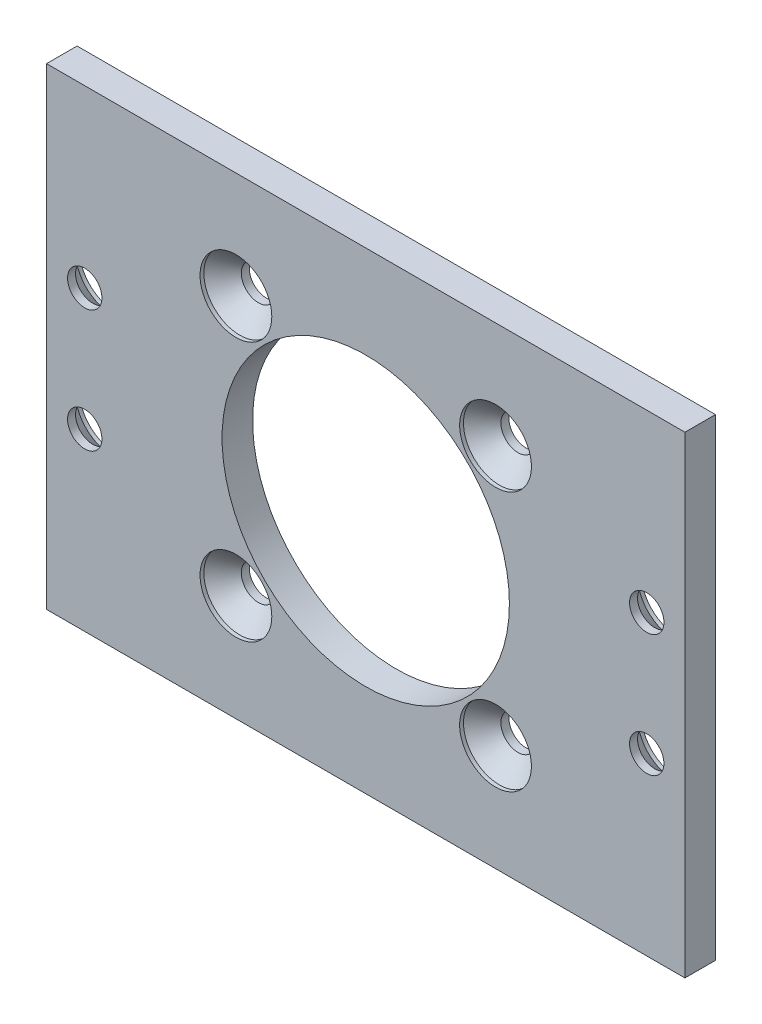
ISO-10303-21;
HEADER;
FILE_DESCRIPTION(('STEP AP214'),'2;1');
FILE_NAME('part.step','',(''),(''),'','','');
FILE_SCHEMA(('AUTOMOTIVE_DESIGN { 1 0 10303 214 1 1 1 1 }'));
ENDSEC;
DATA;
#1=APPLICATION_CONTEXT('core data for automotive mechanical design processes');
#2=APPLICATION_PROTOCOL_DEFINITION('international standard','automotive_design',2000,#1);
#3=PRODUCT_CONTEXT('',#1,'mechanical');
#4=PRODUCT('Part','Part','',(#3));
#5=PRODUCT_RELATED_PRODUCT_CATEGORY('part','',(#4));
#6=PRODUCT_DEFINITION_FORMATION('','',#4);
#7=PRODUCT_DEFINITION_CONTEXT('part definition',#1,'design');
#8=PRODUCT_DEFINITION('design','',#6,#7);
#9=PRODUCT_DEFINITION_SHAPE('','',#8);
#10=(LENGTH_UNIT() NAMED_UNIT(*) SI_UNIT(.MILLI.,.METRE.));
#11=(NAMED_UNIT(*) PLANE_ANGLE_UNIT() SI_UNIT($,.RADIAN.));
#12=(NAMED_UNIT(*) SI_UNIT($,.STERADIAN.) SOLID_ANGLE_UNIT());
#13=UNCERTAINTY_MEASURE_WITH_UNIT(LENGTH_MEASURE(1.E-05),#10,'distance_accuracy_value','');
#14=(GEOMETRIC_REPRESENTATION_CONTEXT(3) GLOBAL_UNCERTAINTY_ASSIGNED_CONTEXT((#13)) GLOBAL_UNIT_ASSIGNED_CONTEXT((#10,
#11,#12)) REPRESENTATION_CONTEXT('',''));
#15=CARTESIAN_POINT('',(0.,0.,0.));
#16=DIRECTION('',(0.,0.,1.));
#17=DIRECTION('',(1.,0.,0.));
#18=AXIS2_PLACEMENT_3D('',#15,#16,#17);
#19=CARTESIAN_POINT('',(0.,0.,4.));
#20=DIRECTION('',(0.,0.,1.));
#21=DIRECTION('',(1.,0.,0.));
#22=AXIS2_PLACEMENT_3D('',#19,#20,#21);
#23=PLANE('',#22);
#24=CARTESIAN_POINT('',(-36.8,8.00000000000001,4.));
#25=DIRECTION('',(0.,0.,1.));
#26=DIRECTION('',(1.,0.,0.));
#27=AXIS2_PLACEMENT_3D('',#24,#25,#26);
#28=CIRCLE('',#27,2.25000000000001);
#29=CARTESIAN_POINT('',(-34.55,8.00000000000001,4.));
#30=VERTEX_POINT('',#29);
#31=EDGE_CURVE('E36',#30,#30,#28,.T.);
#32=ORIENTED_EDGE('',*,*,#31,.F.);
#33=EDGE_LOOP('',(#32));
#34=FACE_BOUND('',#33,.T.);
#35=CARTESIAN_POINT('',(-36.8,-8.,4.));
#36=DIRECTION('',(0.,0.,1.));
#37=DIRECTION('',(1.,0.,0.));
#38=AXIS2_PLACEMENT_3D('',#35,#36,#37);
#39=CIRCLE('',#38,2.25000000000001);
#40=CARTESIAN_POINT('',(-34.55,-8.,4.));
#41=VERTEX_POINT('',#40);
#42=EDGE_CURVE('E137',#41,#41,#39,.T.);
#43=ORIENTED_EDGE('',*,*,#42,.F.);
#44=EDGE_LOOP('',(#43));
#45=FACE_BOUND('',#44,.T.);
#46=CARTESIAN_POINT('',(36.8,-8.00000000000001,4.));
#47=DIRECTION('',(0.,0.,1.));
#48=DIRECTION('',(1.,0.,0.));
#49=AXIS2_PLACEMENT_3D('',#46,#47,#48);
#50=CIRCLE('',#49,2.25000000000001);
#51=CARTESIAN_POINT('',(39.05,-8.00000000000001,4.));
#52=VERTEX_POINT('',#51);
#53=EDGE_CURVE('E133',#52,#52,#50,.T.);
#54=ORIENTED_EDGE('',*,*,#53,.F.);
#55=EDGE_LOOP('',(#54));
#56=FACE_BOUND('',#55,.T.);
#57=CARTESIAN_POINT('',(36.8,7.99999999999999,4.));
#58=DIRECTION('',(0.,0.,1.));
#59=DIRECTION('',(1.,0.,0.));
#60=AXIS2_PLACEMENT_3D('',#57,#58,#59);
#61=CIRCLE('',#60,2.25000000000001);
#62=CARTESIAN_POINT('',(39.05,7.99999999999999,4.));
#63=VERTEX_POINT('',#62);
#64=EDGE_CURVE('E128',#63,#63,#61,.T.);
#65=ORIENTED_EDGE('',*,*,#64,.F.);
#66=EDGE_LOOP('',(#65));
#67=FACE_BOUND('',#66,.T.);
#68=CARTESIAN_POINT('',(-17.,17.,4.));
#69=DIRECTION('',(0.,0.,1.));
#70=DIRECTION('',(1.,0.,0.));
#71=AXIS2_PLACEMENT_3D('',#68,#69,#70);
#72=CIRCLE('',#71,4.7);
#73=CARTESIAN_POINT('',(-12.3,17.,4.));
#74=VERTEX_POINT('',#73);
#75=EDGE_CURVE('E131',#74,#74,#72,.T.);
#76=ORIENTED_EDGE('',*,*,#75,.F.);
#77=EDGE_LOOP('',(#76));
#78=FACE_BOUND('',#77,.T.);
#79=CARTESIAN_POINT('',(17.,17.,4.));
#80=DIRECTION('',(0.,0.,1.));
#81=DIRECTION('',(1.,0.,0.));
#82=AXIS2_PLACEMENT_3D('',#79,#80,#81);
#83=CIRCLE('',#82,4.7);
#84=CARTESIAN_POINT('',(21.7,17.,4.));
#85=VERTEX_POINT('',#84);
#86=EDGE_CURVE('E126',#85,#85,#83,.T.);
#87=ORIENTED_EDGE('',*,*,#86,.F.);
#88=EDGE_LOOP('',(#87));
#89=FACE_BOUND('',#88,.T.);
#90=CARTESIAN_POINT('',(17.,-17.,4.));
#91=DIRECTION('',(0.,0.,1.));
#92=DIRECTION('',(1.,0.,0.));
#93=AXIS2_PLACEMENT_3D('',#90,#91,#92);
#94=CIRCLE('',#93,4.7);
#95=CARTESIAN_POINT('',(21.7,-17.,4.));
#96=VERTEX_POINT('',#95);
#97=EDGE_CURVE('E121',#96,#96,#94,.T.);
#98=ORIENTED_EDGE('',*,*,#97,.F.);
#99=EDGE_LOOP('',(#98));
#100=FACE_BOUND('',#99,.T.);
#101=CARTESIAN_POINT('',(-17.,-17.,4.));
#102=DIRECTION('',(0.,0.,1.));
#103=DIRECTION('',(1.,0.,0.));
#104=AXIS2_PLACEMENT_3D('',#101,#102,#103);
#105=CIRCLE('',#104,4.7);
#106=CARTESIAN_POINT('',(-12.3,-17.,4.));
#107=VERTEX_POINT('',#106);
#108=EDGE_CURVE('E116',#107,#107,#105,.T.);
#109=ORIENTED_EDGE('',*,*,#108,.F.);
#110=EDGE_LOOP('',(#109));
#111=FACE_BOUND('',#110,.T.);
#112=DIRECTION('',(0.,1.,0.));
#113=VECTOR('',#112,1.);
#114=CARTESIAN_POINT('',(41.8,-30.95,4.));
#115=LINE('',#114,#113);
#116=CARTESIAN_POINT('',(41.8,-30.95,4.));
#117=VERTEX_POINT('',#116);
#118=CARTESIAN_POINT('',(41.8,30.95,4.));
#119=VERTEX_POINT('',#118);
#120=EDGE_CURVE('E86',#117,#119,#115,.T.);
#121=ORIENTED_EDGE('',*,*,#120,.T.);
#122=DIRECTION('',(-1.,0.,0.));
#123=VECTOR('',#122,1.);
#124=CARTESIAN_POINT('',(41.8,30.95,4.));
#125=LINE('',#124,#123);
#126=CARTESIAN_POINT('',(-41.8,30.95,4.));
#127=VERTEX_POINT('',#126);
#128=EDGE_CURVE('E81',#119,#127,#125,.T.);
#129=ORIENTED_EDGE('',*,*,#128,.T.);
#130=DIRECTION('',(0.,-1.,0.));
#131=VECTOR('',#130,1.);
#132=CARTESIAN_POINT('',(-41.8,-30.95,4.));
#133=LINE('',#132,#131);
#134=CARTESIAN_POINT('',(-41.8,-30.95,4.));
#135=VERTEX_POINT('',#134);
#136=EDGE_CURVE('E84',#127,#135,#133,.T.);
#137=ORIENTED_EDGE('',*,*,#136,.T.);
#138=DIRECTION('',(1.,0.,0.));
#139=VECTOR('',#138,1.);
#140=CARTESIAN_POINT('',(41.8,-30.95,4.));
#141=LINE('',#140,#139);
#142=EDGE_CURVE('E51',#135,#117,#141,.T.);
#143=ORIENTED_EDGE('',*,*,#142,.T.);
#144=EDGE_LOOP('',(#121,#129,#137,#143));
#145=FACE_BOUND('',#144,.T.);
#146=CARTESIAN_POINT('',(0.,0.,4.));
#147=DIRECTION('',(0.,0.,1.));
#148=DIRECTION('',(1.,0.,0.));
#149=AXIS2_PLACEMENT_3D('',#146,#147,#148);
#150=CIRCLE('',#149,18.813799134989);
#151=CARTESIAN_POINT('',(18.813799134989,0.,4.));
#152=VERTEX_POINT('',#151);
#153=EDGE_CURVE('E102',#152,#152,#150,.T.);
#154=ORIENTED_EDGE('',*,*,#153,.F.);
#155=EDGE_LOOP('',(#154));
#156=FACE_BOUND('',#155,.T.);
#157=ADVANCED_FACE('F32',(#34,#45,#56,#67,#78,#89,#100,#111,#145,#156),#23,.T.);
#158=CARTESIAN_POINT('',(0.,0.,0.));
#159=DIRECTION('',(0.,0.,1.));
#160=DIRECTION('',(1.,0.,0.));
#161=AXIS2_PLACEMENT_3D('',#158,#159,#160);
#162=PLANE('',#161);
#163=CARTESIAN_POINT('',(-36.8,8.00000000000001,0.));
#164=DIRECTION('',(0.,0.,-1.));
#165=DIRECTION('',(-1.,0.,0.));
#166=AXIS2_PLACEMENT_3D('',#163,#164,#165);
#167=CIRCLE('',#166,4.7);
#168=CARTESIAN_POINT('',(-41.5,8.00000000000001,0.));
#169=VERTEX_POINT('',#168);
#170=EDGE_CURVE('E545',#169,#169,#167,.T.);
#171=ORIENTED_EDGE('',*,*,#170,.F.);
#172=EDGE_LOOP('',(#171));
#173=FACE_BOUND('',#172,.T.);
#174=CARTESIAN_POINT('',(-36.8,-8.,0.));
#175=DIRECTION('',(0.,0.,-1.));
#176=DIRECTION('',(-1.,0.,0.));
#177=AXIS2_PLACEMENT_3D('',#174,#175,#176);
#178=CIRCLE('',#177,4.7);
#179=CARTESIAN_POINT('',(-41.5,-8.,0.));
#180=VERTEX_POINT('',#179);
#181=EDGE_CURVE('E152',#180,#180,#178,.T.);
#182=ORIENTED_EDGE('',*,*,#181,.F.);
#183=EDGE_LOOP('',(#182));
#184=FACE_BOUND('',#183,.T.);
#185=CARTESIAN_POINT('',(36.8,-8.00000000000001,0.));
#186=DIRECTION('',(0.,0.,-1.));
#187=DIRECTION('',(-1.,0.,0.));
#188=AXIS2_PLACEMENT_3D('',#185,#186,#187);
#189=CIRCLE('',#188,4.7);
#190=CARTESIAN_POINT('',(32.1,-8.00000000000001,0.));
#191=VERTEX_POINT('',#190);
#192=EDGE_CURVE('E139',#191,#191,#189,.T.);
#193=ORIENTED_EDGE('',*,*,#192,.F.);
#194=EDGE_LOOP('',(#193));
#195=FACE_BOUND('',#194,.T.);
#196=CARTESIAN_POINT('',(36.8,7.99999999999999,0.));
#197=DIRECTION('',(0.,0.,-1.));
#198=DIRECTION('',(-1.,0.,0.));
#199=AXIS2_PLACEMENT_3D('',#196,#197,#198);
#200=CIRCLE('',#199,4.7);
#201=CARTESIAN_POINT('',(32.1,7.99999999999999,0.));
#202=VERTEX_POINT('',#201);
#203=EDGE_CURVE('E135',#202,#202,#200,.T.);
#204=ORIENTED_EDGE('',*,*,#203,.F.);
#205=EDGE_LOOP('',(#204));
#206=FACE_BOUND('',#205,.T.);
#207=CARTESIAN_POINT('',(-17.,17.,0.));
#208=DIRECTION('',(0.,0.,1.));
#209=DIRECTION('',(1.,0.,0.));
#210=AXIS2_PLACEMENT_3D('',#207,#208,#209);
#211=CIRCLE('',#210,2.25);
#212=CARTESIAN_POINT('',(-14.75,17.,0.));
#213=VERTEX_POINT('',#212);
#214=EDGE_CURVE('E123',#213,#213,#211,.T.);
#215=ORIENTED_EDGE('',*,*,#214,.T.);
#216=EDGE_LOOP('',(#215));
#217=FACE_BOUND('',#216,.T.);
#218=CARTESIAN_POINT('',(17.,17.,0.));
#219=DIRECTION('',(0.,0.,1.));
#220=DIRECTION('',(1.,0.,0.));
#221=AXIS2_PLACEMENT_3D('',#218,#219,#220);
#222=CIRCLE('',#221,2.25);
#223=CARTESIAN_POINT('',(19.25,17.,0.));
#224=VERTEX_POINT('',#223);
#225=EDGE_CURVE('E118',#224,#224,#222,.T.);
#226=ORIENTED_EDGE('',*,*,#225,.T.);
#227=EDGE_LOOP('',(#226));
#228=FACE_BOUND('',#227,.T.);
#229=CARTESIAN_POINT('',(17.,-17.,0.));
#230=DIRECTION('',(0.,0.,1.));
#231=DIRECTION('',(1.,0.,0.));
#232=AXIS2_PLACEMENT_3D('',#229,#230,#231);
#233=CIRCLE('',#232,2.25);
#234=CARTESIAN_POINT('',(19.25,-17.,0.));
#235=VERTEX_POINT('',#234);
#236=EDGE_CURVE('E113',#235,#235,#233,.T.);
#237=ORIENTED_EDGE('',*,*,#236,.T.);
#238=EDGE_LOOP('',(#237));
#239=FACE_BOUND('',#238,.T.);
#240=CARTESIAN_POINT('',(-17.,-17.,0.));
#241=DIRECTION('',(0.,0.,1.));
#242=DIRECTION('',(1.,0.,0.));
#243=AXIS2_PLACEMENT_3D('',#240,#241,#242);
#244=CIRCLE('',#243,2.25);
#245=CARTESIAN_POINT('',(-14.75,-17.,0.));
#246=VERTEX_POINT('',#245);
#247=EDGE_CURVE('E108',#246,#246,#244,.T.);
#248=ORIENTED_EDGE('',*,*,#247,.T.);
#249=EDGE_LOOP('',(#248));
#250=FACE_BOUND('',#249,.T.);
#251=DIRECTION('',(0.,1.,0.));
#252=VECTOR('',#251,1.);
#253=CARTESIAN_POINT('',(41.8,-30.95,0.));
#254=LINE('',#253,#252);
#255=CARTESIAN_POINT('',(41.8,-30.95,0.));
#256=VERTEX_POINT('',#255);
#257=CARTESIAN_POINT('',(41.8,30.95,0.));
#258=VERTEX_POINT('',#257);
#259=EDGE_CURVE('E99',#256,#258,#254,.T.);
#260=ORIENTED_EDGE('',*,*,#259,.F.);
#261=DIRECTION('',(1.,0.,0.));
#262=VECTOR('',#261,1.);
#263=CARTESIAN_POINT('',(41.8,-30.95,0.));
#264=LINE('',#263,#262);
#265=CARTESIAN_POINT('',(-41.8,-30.95,0.));
#266=VERTEX_POINT('',#265);
#267=EDGE_CURVE('E74',#266,#256,#264,.T.);
#268=ORIENTED_EDGE('',*,*,#267,.F.);
#269=DIRECTION('',(0.,-1.,0.));
#270=VECTOR('',#269,1.);
#271=CARTESIAN_POINT('',(-41.8,-30.95,0.));
#272=LINE('',#271,#270);
#273=CARTESIAN_POINT('',(-41.8,30.95,0.));
#274=VERTEX_POINT('',#273);
#275=EDGE_CURVE('E68',#274,#266,#272,.T.);
#276=ORIENTED_EDGE('',*,*,#275,.F.);
#277=DIRECTION('',(-1.,0.,0.));
#278=VECTOR('',#277,1.);
#279=CARTESIAN_POINT('',(41.8,30.95,0.));
#280=LINE('',#279,#278);
#281=EDGE_CURVE('E90',#258,#274,#280,.T.);
#282=ORIENTED_EDGE('',*,*,#281,.F.);
#283=EDGE_LOOP('',(#260,#268,#276,#282));
#284=FACE_BOUND('',#283,.T.);
#285=CARTESIAN_POINT('',(0.,0.,0.));
#286=DIRECTION('',(0.,0.,1.));
#287=DIRECTION('',(1.,0.,0.));
#288=AXIS2_PLACEMENT_3D('',#285,#286,#287);
#289=CIRCLE('',#288,18.813799134989);
#290=CARTESIAN_POINT('',(18.813799134989,0.,0.));
#291=VERTEX_POINT('',#290);
#292=EDGE_CURVE('E111',#291,#291,#289,.T.);
#293=ORIENTED_EDGE('',*,*,#292,.T.);
#294=EDGE_LOOP('',(#293));
#295=FACE_BOUND('',#294,.T.);
#296=ADVANCED_FACE('F200',(#173,#184,#195,#206,#217,#228,#239,#250,#284,#295),#162,.F.);
#297=CARTESIAN_POINT('',(41.8,-30.95,4.));
#298=DIRECTION('',(-1.,0.,0.));
#299=DIRECTION('',(0.,-1.,0.));
#300=AXIS2_PLACEMENT_3D('',#297,#298,#299);
#301=PLANE('',#300);
#302=ORIENTED_EDGE('',*,*,#259,.T.);
#303=DIRECTION('',(0.,0.,-1.));
#304=VECTOR('',#303,1.);
#305=CARTESIAN_POINT('',(41.8,30.95,4.));
#306=LINE('',#305,#304);
#307=EDGE_CURVE('E11',#119,#258,#306,.T.);
#308=ORIENTED_EDGE('',*,*,#307,.F.);
#309=ORIENTED_EDGE('',*,*,#120,.F.);
#310=DIRECTION('',(0.,0.,-1.));
#311=VECTOR('',#310,1.);
#312=CARTESIAN_POINT('',(41.8,-30.95,4.));
#313=LINE('',#312,#311);
#314=EDGE_CURVE('E95',#117,#256,#313,.T.);
#315=ORIENTED_EDGE('',*,*,#314,.T.);
#316=EDGE_LOOP('',(#302,#308,#309,#315));
#317=FACE_BOUND('',#316,.T.);
#318=ADVANCED_FACE('F34',(#317),#301,.F.);
#319=CARTESIAN_POINT('',(41.8,30.95,4.));
#320=DIRECTION('',(0.,-1.,0.));
#321=DIRECTION('',(1.,0.,0.));
#322=AXIS2_PLACEMENT_3D('',#319,#320,#321);
#323=PLANE('',#322);
#324=ORIENTED_EDGE('',*,*,#281,.T.);
#325=DIRECTION('',(0.,0.,-1.));
#326=VECTOR('',#325,1.);
#327=CARTESIAN_POINT('',(-41.8,30.95,4.));
#328=LINE('',#327,#326);
#329=EDGE_CURVE('E42',#127,#274,#328,.T.);
#330=ORIENTED_EDGE('',*,*,#329,.F.);
#331=ORIENTED_EDGE('',*,*,#128,.F.);
#332=ORIENTED_EDGE('',*,*,#307,.T.);
#333=EDGE_LOOP('',(#324,#330,#331,#332));
#334=FACE_BOUND('',#333,.T.);
#335=ADVANCED_FACE('F89',(#334),#323,.F.);
#336=CARTESIAN_POINT('',(-41.8,-30.95,4.));
#337=DIRECTION('',(1.,0.,0.));
#338=DIRECTION('',(0.,0.,-1.));
#339=AXIS2_PLACEMENT_3D('',#336,#337,#338);
#340=PLANE('',#339);
#341=ORIENTED_EDGE('',*,*,#275,.T.);
#342=DIRECTION('',(0.,0.,-1.));
#343=VECTOR('',#342,1.);
#344=CARTESIAN_POINT('',(-41.8,-30.95,4.));
#345=LINE('',#344,#343);
#346=EDGE_CURVE('E91',#135,#266,#345,.T.);
#347=ORIENTED_EDGE('',*,*,#346,.F.);
#348=ORIENTED_EDGE('',*,*,#136,.F.);
#349=ORIENTED_EDGE('',*,*,#329,.T.);
#350=EDGE_LOOP('',(#341,#347,#348,#349));
#351=FACE_BOUND('',#350,.T.);
#352=ADVANCED_FACE('F93',(#351),#340,.F.);
#353=CARTESIAN_POINT('',(41.8,-30.95,4.));
#354=DIRECTION('',(0.,1.,0.));
#355=DIRECTION('',(-1.,0.,0.));
#356=AXIS2_PLACEMENT_3D('',#353,#354,#355);
#357=PLANE('',#356);
#358=ORIENTED_EDGE('',*,*,#267,.T.);
#359=ORIENTED_EDGE('',*,*,#314,.F.);
#360=ORIENTED_EDGE('',*,*,#142,.F.);
#361=ORIENTED_EDGE('',*,*,#346,.T.);
#362=EDGE_LOOP('',(#358,#359,#360,#361));
#363=FACE_BOUND('',#362,.T.);
#364=ADVANCED_FACE('F205',(#363),#357,.F.);
#365=CARTESIAN_POINT('',(0.,0.,4.));
#366=DIRECTION('',(0.,0.,-1.));
#367=DIRECTION('',(-1.,0.,0.));
#368=AXIS2_PLACEMENT_3D('',#365,#366,#367);
#369=CYLINDRICAL_SURFACE('',#368,18.813799134989);
#370=ORIENTED_EDGE('',*,*,#153,.T.);
#371=EDGE_LOOP('',(#370));
#372=FACE_BOUND('',#371,.T.);
#373=ORIENTED_EDGE('',*,*,#292,.F.);
#374=EDGE_LOOP('',(#373));
#375=FACE_BOUND('',#374,.T.);
#376=ADVANCED_FACE('F202',(#372,#375),#369,.F.);
#377=CARTESIAN_POINT('',(-17.,-17.,4.));
#378=DIRECTION('',(0.,0.,1.));
#379=DIRECTION('',(1.,0.,0.));
#380=AXIS2_PLACEMENT_3D('',#377,#378,#379);
#381=CYLINDRICAL_SURFACE('',#380,2.25);
#382=CARTESIAN_POINT('',(-17.,-17.,1.05));
#383=DIRECTION('',(0.,0.,1.));
#384=DIRECTION('',(1.,0.,0.));
#385=AXIS2_PLACEMENT_3D('',#382,#383,#384);
#386=CIRCLE('',#385,2.25);
#387=CARTESIAN_POINT('',(-14.75,-17.,1.05));
#388=VERTEX_POINT('',#387);
#389=EDGE_CURVE('E112',#388,#388,#386,.T.);
#390=ORIENTED_EDGE('',*,*,#389,.T.);
#391=EDGE_LOOP('',(#390));
#392=FACE_BOUND('',#391,.T.);
#393=ORIENTED_EDGE('',*,*,#247,.F.);
#394=EDGE_LOOP('',(#393));
#395=FACE_BOUND('',#394,.T.);
#396=ADVANCED_FACE('F204',(#392,#395),#381,.F.);
#397=CARTESIAN_POINT('',(-17.,-17.,3.5));
#398=DIRECTION('',(0.,0.,1.));
#399=DIRECTION('',(1.,0.,0.));
#400=AXIS2_PLACEMENT_3D('',#397,#398,#399);
#401=CONICAL_SURFACE('',#400,4.7,0.785398163397448);
#402=ORIENTED_EDGE('',*,*,#389,.F.);
#403=EDGE_LOOP('',(#402));
#404=FACE_BOUND('',#403,.T.);
#405=CARTESIAN_POINT('',(-17.,-17.,3.5));
#406=DIRECTION('',(0.,0.,1.));
#407=DIRECTION('',(1.,0.,0.));
#408=AXIS2_PLACEMENT_3D('',#405,#406,#407);
#409=CIRCLE('',#408,4.7);
#410=CARTESIAN_POINT('',(-12.3,-17.,3.5));
#411=VERTEX_POINT('',#410);
#412=EDGE_CURVE('E190',#411,#411,#409,.T.);
#413=ORIENTED_EDGE('',*,*,#412,.T.);
#414=EDGE_LOOP('',(#413));
#415=FACE_BOUND('',#414,.T.);
#416=ADVANCED_FACE('F212',(#404,#415),#401,.F.);
#417=CARTESIAN_POINT('',(-17.,-17.,4.));
#418=DIRECTION('',(0.,0.,1.));
#419=DIRECTION('',(1.,0.,0.));
#420=AXIS2_PLACEMENT_3D('',#417,#418,#419);
#421=CYLINDRICAL_SURFACE('',#420,4.7);
#422=ORIENTED_EDGE('',*,*,#412,.F.);
#423=EDGE_LOOP('',(#422));
#424=FACE_BOUND('',#423,.T.);
#425=ORIENTED_EDGE('',*,*,#108,.T.);
#426=EDGE_LOOP('',(#425));
#427=FACE_BOUND('',#426,.T.);
#428=ADVANCED_FACE('F406',(#424,#427),#421,.F.);
#429=CARTESIAN_POINT('',(17.,-17.,4.));
#430=DIRECTION('',(0.,0.,1.));
#431=DIRECTION('',(1.,0.,0.));
#432=AXIS2_PLACEMENT_3D('',#429,#430,#431);
#433=CYLINDRICAL_SURFACE('',#432,2.25);
#434=CARTESIAN_POINT('',(17.,-17.,1.05));
#435=DIRECTION('',(0.,0.,1.));
#436=DIRECTION('',(1.,0.,0.));
#437=AXIS2_PLACEMENT_3D('',#434,#435,#436);
#438=CIRCLE('',#437,2.25);
#439=CARTESIAN_POINT('',(19.25,-17.,1.05));
#440=VERTEX_POINT('',#439);
#441=EDGE_CURVE('E117',#440,#440,#438,.T.);
#442=ORIENTED_EDGE('',*,*,#441,.T.);
#443=EDGE_LOOP('',(#442));
#444=FACE_BOUND('',#443,.T.);
#445=ORIENTED_EDGE('',*,*,#236,.F.);
#446=EDGE_LOOP('',(#445));
#447=FACE_BOUND('',#446,.T.);
#448=ADVANCED_FACE('F402',(#444,#447),#433,.F.);
#449=CARTESIAN_POINT('',(17.,-17.,3.5));
#450=DIRECTION('',(0.,0.,1.));
#451=DIRECTION('',(1.,0.,0.));
#452=AXIS2_PLACEMENT_3D('',#449,#450,#451);
#453=CONICAL_SURFACE('',#452,4.7,0.785398163397447);
#454=ORIENTED_EDGE('',*,*,#441,.F.);
#455=EDGE_LOOP('',(#454));
#456=FACE_BOUND('',#455,.T.);
#457=CARTESIAN_POINT('',(17.,-17.,3.5));
#458=DIRECTION('',(0.,0.,1.));
#459=DIRECTION('',(1.,0.,0.));
#460=AXIS2_PLACEMENT_3D('',#457,#458,#459);
#461=CIRCLE('',#460,4.7);
#462=CARTESIAN_POINT('',(21.7,-17.,3.5));
#463=VERTEX_POINT('',#462);
#464=EDGE_CURVE('E183',#463,#463,#461,.T.);
#465=ORIENTED_EDGE('',*,*,#464,.T.);
#466=EDGE_LOOP('',(#465));
#467=FACE_BOUND('',#466,.T.);
#468=ADVANCED_FACE('F398',(#456,#467),#453,.F.);
#469=CARTESIAN_POINT('',(17.,-17.,4.));
#470=DIRECTION('',(0.,0.,1.));
#471=DIRECTION('',(1.,0.,0.));
#472=AXIS2_PLACEMENT_3D('',#469,#470,#471);
#473=CYLINDRICAL_SURFACE('',#472,4.7);
#474=ORIENTED_EDGE('',*,*,#464,.F.);
#475=EDGE_LOOP('',(#474));
#476=FACE_BOUND('',#475,.T.);
#477=ORIENTED_EDGE('',*,*,#97,.T.);
#478=EDGE_LOOP('',(#477));
#479=FACE_BOUND('',#478,.T.);
#480=ADVANCED_FACE('F394',(#476,#479),#473,.F.);
#481=CARTESIAN_POINT('',(17.,17.,4.));
#482=DIRECTION('',(0.,0.,1.));
#483=DIRECTION('',(1.,0.,0.));
#484=AXIS2_PLACEMENT_3D('',#481,#482,#483);
#485=CYLINDRICAL_SURFACE('',#484,2.25);
#486=CARTESIAN_POINT('',(17.,17.,1.05));
#487=DIRECTION('',(0.,0.,1.));
#488=DIRECTION('',(1.,0.,0.));
#489=AXIS2_PLACEMENT_3D('',#486,#487,#488);
#490=CIRCLE('',#489,2.25);
#491=CARTESIAN_POINT('',(19.25,17.,1.05));
#492=VERTEX_POINT('',#491);
#493=EDGE_CURVE('E122',#492,#492,#490,.T.);
#494=ORIENTED_EDGE('',*,*,#493,.T.);
#495=EDGE_LOOP('',(#494));
#496=FACE_BOUND('',#495,.T.);
#497=ORIENTED_EDGE('',*,*,#225,.F.);
#498=EDGE_LOOP('',(#497));
#499=FACE_BOUND('',#498,.T.);
#500=ADVANCED_FACE('F390',(#496,#499),#485,.F.);
#501=CARTESIAN_POINT('',(17.,17.,3.5));
#502=DIRECTION('',(0.,0.,1.));
#503=DIRECTION('',(1.,0.,0.));
#504=AXIS2_PLACEMENT_3D('',#501,#502,#503);
#505=CONICAL_SURFACE('',#504,4.7,0.785398163397447);
#506=ORIENTED_EDGE('',*,*,#493,.F.);
#507=EDGE_LOOP('',(#506));
#508=FACE_BOUND('',#507,.T.);
#509=CARTESIAN_POINT('',(17.,17.,3.5));
#510=DIRECTION('',(0.,0.,1.));
#511=DIRECTION('',(1.,0.,0.));
#512=AXIS2_PLACEMENT_3D('',#509,#510,#511);
#513=CIRCLE('',#512,4.7);
#514=CARTESIAN_POINT('',(21.7,17.,3.5));
#515=VERTEX_POINT('',#514);
#516=EDGE_CURVE('E176',#515,#515,#513,.T.);
#517=ORIENTED_EDGE('',*,*,#516,.T.);
#518=EDGE_LOOP('',(#517));
#519=FACE_BOUND('',#518,.T.);
#520=ADVANCED_FACE('F386',(#508,#519),#505,.F.);
#521=CARTESIAN_POINT('',(17.,17.,4.));
#522=DIRECTION('',(0.,0.,1.));
#523=DIRECTION('',(1.,0.,0.));
#524=AXIS2_PLACEMENT_3D('',#521,#522,#523);
#525=CYLINDRICAL_SURFACE('',#524,4.7);
#526=ORIENTED_EDGE('',*,*,#516,.F.);
#527=EDGE_LOOP('',(#526));
#528=FACE_BOUND('',#527,.T.);
#529=ORIENTED_EDGE('',*,*,#86,.T.);
#530=EDGE_LOOP('',(#529));
#531=FACE_BOUND('',#530,.T.);
#532=ADVANCED_FACE('F382',(#528,#531),#525,.F.);
#533=CARTESIAN_POINT('',(-17.,17.,4.));
#534=DIRECTION('',(0.,0.,1.));
#535=DIRECTION('',(1.,0.,0.));
#536=AXIS2_PLACEMENT_3D('',#533,#534,#535);
#537=CYLINDRICAL_SURFACE('',#536,2.25);
#538=CARTESIAN_POINT('',(-17.,17.,1.05));
#539=DIRECTION('',(0.,0.,1.));
#540=DIRECTION('',(1.,0.,0.));
#541=AXIS2_PLACEMENT_3D('',#538,#539,#540);
#542=CIRCLE('',#541,2.25);
#543=CARTESIAN_POINT('',(-14.75,17.,1.05));
#544=VERTEX_POINT('',#543);
#545=EDGE_CURVE('E127',#544,#544,#542,.T.);
#546=ORIENTED_EDGE('',*,*,#545,.T.);
#547=EDGE_LOOP('',(#546));
#548=FACE_BOUND('',#547,.T.);
#549=ORIENTED_EDGE('',*,*,#214,.F.);
#550=EDGE_LOOP('',(#549));
#551=FACE_BOUND('',#550,.T.);
#552=ADVANCED_FACE('F378',(#548,#551),#537,.F.);
#553=CARTESIAN_POINT('',(-17.,17.,3.5));
#554=DIRECTION('',(0.,0.,1.));
#555=DIRECTION('',(1.,0.,0.));
#556=AXIS2_PLACEMENT_3D('',#553,#554,#555);
#557=CONICAL_SURFACE('',#556,4.7,0.785398163397448);
#558=ORIENTED_EDGE('',*,*,#545,.F.);
#559=EDGE_LOOP('',(#558));
#560=FACE_BOUND('',#559,.T.);
#561=CARTESIAN_POINT('',(-17.,17.,3.5));
#562=DIRECTION('',(0.,0.,1.));
#563=DIRECTION('',(1.,0.,0.));
#564=AXIS2_PLACEMENT_3D('',#561,#562,#563);
#565=CIRCLE('',#564,4.7);
#566=CARTESIAN_POINT('',(-12.3,17.,3.5));
#567=VERTEX_POINT('',#566);
#568=EDGE_CURVE('E169',#567,#567,#565,.T.);
#569=ORIENTED_EDGE('',*,*,#568,.T.);
#570=EDGE_LOOP('',(#569));
#571=FACE_BOUND('',#570,.T.);
#572=ADVANCED_FACE('F374',(#560,#571),#557,.F.);
#573=CARTESIAN_POINT('',(-17.,17.,4.));
#574=DIRECTION('',(0.,0.,1.));
#575=DIRECTION('',(1.,0.,0.));
#576=AXIS2_PLACEMENT_3D('',#573,#574,#575);
#577=CYLINDRICAL_SURFACE('',#576,4.7);
#578=ORIENTED_EDGE('',*,*,#568,.F.);
#579=EDGE_LOOP('',(#578));
#580=FACE_BOUND('',#579,.T.);
#581=ORIENTED_EDGE('',*,*,#75,.T.);
#582=EDGE_LOOP('',(#581));
#583=FACE_BOUND('',#582,.T.);
#584=ADVANCED_FACE('F255',(#580,#583),#577,.F.);
#585=CARTESIAN_POINT('',(36.8,7.99999999999999,0.));
#586=DIRECTION('',(0.,0.,-1.));
#587=DIRECTION('',(-1.,0.,0.));
#588=AXIS2_PLACEMENT_3D('',#585,#586,#587);
#589=CYLINDRICAL_SURFACE('',#588,2.25000000000001);
#590=ORIENTED_EDGE('',*,*,#64,.T.);
#591=EDGE_LOOP('',(#590));
#592=FACE_BOUND('',#591,.T.);
#593=CARTESIAN_POINT('',(36.8,7.99999999999999,2.95));
#594=DIRECTION('',(0.,0.,-1.));
#595=DIRECTION('',(-1.,0.,0.));
#596=AXIS2_PLACEMENT_3D('',#593,#594,#595);
#597=CIRCLE('',#596,2.25);
#598=CARTESIAN_POINT('',(34.55,7.99999999999999,2.95));
#599=VERTEX_POINT('',#598);
#600=EDGE_CURVE('E132',#599,#599,#597,.T.);
#601=ORIENTED_EDGE('',*,*,#600,.T.);
#602=EDGE_LOOP('',(#601));
#603=FACE_BOUND('',#602,.T.);
#604=ADVANCED_FACE('F249',(#592,#603),#589,.F.);
#605=CARTESIAN_POINT('',(36.8,7.99999999999999,0.5));
#606=DIRECTION('',(0.,0.,-1.));
#607=DIRECTION('',(-1.,0.,0.));
#608=AXIS2_PLACEMENT_3D('',#605,#606,#607);
#609=CONICAL_SURFACE('',#608,4.7,0.785398163397449);
#610=ORIENTED_EDGE('',*,*,#600,.F.);
#611=EDGE_LOOP('',(#610));
#612=FACE_BOUND('',#611,.T.);
#613=CARTESIAN_POINT('',(36.8,7.99999999999999,0.5));
#614=DIRECTION('',(0.,0.,-1.));
#615=DIRECTION('',(-1.,0.,0.));
#616=AXIS2_PLACEMENT_3D('',#613,#614,#615);
#617=CIRCLE('',#616,4.7);
#618=CARTESIAN_POINT('',(32.1,7.99999999999999,0.5));
#619=VERTEX_POINT('',#618);
#620=EDGE_CURVE('E162',#619,#619,#617,.T.);
#621=ORIENTED_EDGE('',*,*,#620,.T.);
#622=EDGE_LOOP('',(#621));
#623=FACE_BOUND('',#622,.T.);
#624=ADVANCED_FACE('F254',(#612,#623),#609,.F.);
#625=CARTESIAN_POINT('',(36.8,7.99999999999999,0.));
#626=DIRECTION('',(0.,0.,-1.));
#627=DIRECTION('',(-1.,0.,0.));
#628=AXIS2_PLACEMENT_3D('',#625,#626,#627);
#629=CYLINDRICAL_SURFACE('',#628,4.7);
#630=ORIENTED_EDGE('',*,*,#620,.F.);
#631=EDGE_LOOP('',(#630));
#632=FACE_BOUND('',#631,.T.);
#633=ORIENTED_EDGE('',*,*,#203,.T.);
#634=EDGE_LOOP('',(#633));
#635=FACE_BOUND('',#634,.T.);
#636=ADVANCED_FACE('F267',(#632,#635),#629,.F.);
#637=CARTESIAN_POINT('',(36.8,-8.00000000000001,0.));
#638=DIRECTION('',(0.,0.,-1.));
#639=DIRECTION('',(-1.,0.,0.));
#640=AXIS2_PLACEMENT_3D('',#637,#638,#639);
#641=CYLINDRICAL_SURFACE('',#640,2.25000000000001);
#642=ORIENTED_EDGE('',*,*,#53,.T.);
#643=EDGE_LOOP('',(#642));
#644=FACE_BOUND('',#643,.T.);
#645=CARTESIAN_POINT('',(36.8,-8.00000000000001,2.95));
#646=DIRECTION('',(0.,0.,-1.));
#647=DIRECTION('',(-1.,0.,0.));
#648=AXIS2_PLACEMENT_3D('',#645,#646,#647);
#649=CIRCLE('',#648,2.25);
#650=CARTESIAN_POINT('',(34.55,-8.00000000000001,2.95));
#651=VERTEX_POINT('',#650);
#652=EDGE_CURVE('E136',#651,#651,#649,.T.);
#653=ORIENTED_EDGE('',*,*,#652,.T.);
#654=EDGE_LOOP('',(#653));
#655=FACE_BOUND('',#654,.T.);
#656=ADVANCED_FACE('F277',(#644,#655),#641,.F.);
#657=CARTESIAN_POINT('',(36.8,-8.00000000000001,0.5));
#658=DIRECTION('',(0.,0.,-1.));
#659=DIRECTION('',(-1.,0.,0.));
#660=AXIS2_PLACEMENT_3D('',#657,#658,#659);
#661=CONICAL_SURFACE('',#660,4.7,0.785398163397449);
#662=ORIENTED_EDGE('',*,*,#652,.F.);
#663=EDGE_LOOP('',(#662));
#664=FACE_BOUND('',#663,.T.);
#665=CARTESIAN_POINT('',(36.8,-8.00000000000001,0.5));
#666=DIRECTION('',(0.,0.,-1.));
#667=DIRECTION('',(-1.,0.,0.));
#668=AXIS2_PLACEMENT_3D('',#665,#666,#667);
#669=CIRCLE('',#668,4.7);
#670=CARTESIAN_POINT('',(32.1,-8.00000000000001,0.5));
#671=VERTEX_POINT('',#670);
#672=EDGE_CURVE('E144',#671,#671,#669,.T.);
#673=ORIENTED_EDGE('',*,*,#672,.T.);
#674=EDGE_LOOP('',(#673));
#675=FACE_BOUND('',#674,.T.);
#676=ADVANCED_FACE('F287',(#664,#675),#661,.F.);
#677=CARTESIAN_POINT('',(36.8,-8.00000000000001,0.));
#678=DIRECTION('',(0.,0.,-1.));
#679=DIRECTION('',(-1.,0.,0.));
#680=AXIS2_PLACEMENT_3D('',#677,#678,#679);
#681=CYLINDRICAL_SURFACE('',#680,4.7);
#682=ORIENTED_EDGE('',*,*,#672,.F.);
#683=EDGE_LOOP('',(#682));
#684=FACE_BOUND('',#683,.T.);
#685=ORIENTED_EDGE('',*,*,#192,.T.);
#686=EDGE_LOOP('',(#685));
#687=FACE_BOUND('',#686,.T.);
#688=ADVANCED_FACE('F297',(#684,#687),#681,.F.);
#689=CARTESIAN_POINT('',(-36.8,-8.,0.));
#690=DIRECTION('',(0.,0.,-1.));
#691=DIRECTION('',(-1.,0.,0.));
#692=AXIS2_PLACEMENT_3D('',#689,#690,#691);
#693=CYLINDRICAL_SURFACE('',#692,2.25000000000001);
#694=ORIENTED_EDGE('',*,*,#42,.T.);
#695=EDGE_LOOP('',(#694));
#696=FACE_BOUND('',#695,.T.);
#697=CARTESIAN_POINT('',(-36.8,-8.,2.95));
#698=DIRECTION('',(0.,0.,-1.));
#699=DIRECTION('',(-1.,0.,0.));
#700=AXIS2_PLACEMENT_3D('',#697,#698,#699);
#701=CIRCLE('',#700,2.25);
#702=CARTESIAN_POINT('',(-39.05,-8.,2.95));
#703=VERTEX_POINT('',#702);
#704=EDGE_CURVE('E140',#703,#703,#701,.T.);
#705=ORIENTED_EDGE('',*,*,#704,.T.);
#706=EDGE_LOOP('',(#705));
#707=FACE_BOUND('',#706,.T.);
#708=ADVANCED_FACE('F307',(#696,#707),#693,.F.);
#709=CARTESIAN_POINT('',(-36.8,-8.,0.5));
#710=DIRECTION('',(0.,0.,-1.));
#711=DIRECTION('',(-1.,0.,0.));
#712=AXIS2_PLACEMENT_3D('',#709,#710,#711);
#713=CONICAL_SURFACE('',#712,4.7,0.785398163397449);
#714=ORIENTED_EDGE('',*,*,#704,.F.);
#715=EDGE_LOOP('',(#714));
#716=FACE_BOUND('',#715,.T.);
#717=CARTESIAN_POINT('',(-36.8,-8.,0.5));
#718=DIRECTION('',(0.,0.,-1.));
#719=DIRECTION('',(-1.,0.,0.));
#720=AXIS2_PLACEMENT_3D('',#717,#718,#719);
#721=CIRCLE('',#720,4.7);
#722=CARTESIAN_POINT('',(-41.5,-8.,0.5));
#723=VERTEX_POINT('',#722);
#724=EDGE_CURVE('E147',#723,#723,#721,.T.);
#725=ORIENTED_EDGE('',*,*,#724,.T.);
#726=EDGE_LOOP('',(#725));
#727=FACE_BOUND('',#726,.T.);
#728=ADVANCED_FACE('F317',(#716,#727),#713,.F.);
#729=CARTESIAN_POINT('',(-36.8,-8.,0.));
#730=DIRECTION('',(0.,0.,-1.));
#731=DIRECTION('',(-1.,0.,0.));
#732=AXIS2_PLACEMENT_3D('',#729,#730,#731);
#733=CYLINDRICAL_SURFACE('',#732,4.7);
#734=ORIENTED_EDGE('',*,*,#724,.F.);
#735=EDGE_LOOP('',(#734));
#736=FACE_BOUND('',#735,.T.);
#737=ORIENTED_EDGE('',*,*,#181,.T.);
#738=EDGE_LOOP('',(#737));
#739=FACE_BOUND('',#738,.T.);
#740=ADVANCED_FACE('F326',(#736,#739),#733,.F.);
#741=CARTESIAN_POINT('',(-36.8,8.00000000000001,0.));
#742=DIRECTION('',(0.,0.,-1.));
#743=DIRECTION('',(-1.,0.,0.));
#744=AXIS2_PLACEMENT_3D('',#741,#742,#743);
#745=CYLINDRICAL_SURFACE('',#744,2.25000000000001);
#746=ORIENTED_EDGE('',*,*,#31,.T.);
#747=EDGE_LOOP('',(#746));
#748=FACE_BOUND('',#747,.T.);
#749=CARTESIAN_POINT('',(-36.8,8.00000000000001,2.95));
#750=DIRECTION('',(0.,0.,-1.));
#751=DIRECTION('',(-1.,0.,0.));
#752=AXIS2_PLACEMENT_3D('',#749,#750,#751);
#753=CIRCLE('',#752,2.25);
#754=CARTESIAN_POINT('',(-39.05,8.00000000000001,2.95));
#755=VERTEX_POINT('',#754);
#756=EDGE_CURVE('E547',#755,#755,#753,.T.);
#757=ORIENTED_EDGE('',*,*,#756,.T.);
#758=EDGE_LOOP('',(#757));
#759=FACE_BOUND('',#758,.T.);
#760=ADVANCED_FACE('F336',(#748,#759),#745,.F.);
#761=CARTESIAN_POINT('',(-36.8,8.00000000000001,0.5));
#762=DIRECTION('',(0.,0.,-1.));
#763=DIRECTION('',(-1.,0.,0.));
#764=AXIS2_PLACEMENT_3D('',#761,#762,#763);
#765=CONICAL_SURFACE('',#764,4.7,0.785398163397449);
#766=ORIENTED_EDGE('',*,*,#756,.F.);
#767=EDGE_LOOP('',(#766));
#768=FACE_BOUND('',#767,.T.);
#769=CARTESIAN_POINT('',(-36.8,8.00000000000001,0.5));
#770=DIRECTION('',(0.,0.,-1.));
#771=DIRECTION('',(-1.,0.,0.));
#772=AXIS2_PLACEMENT_3D('',#769,#770,#771);
#773=CIRCLE('',#772,4.7);
#774=CARTESIAN_POINT('',(-41.5,8.00000000000001,0.5));
#775=VERTEX_POINT('',#774);
#776=EDGE_CURVE('E542',#775,#775,#773,.T.);
#777=ORIENTED_EDGE('',*,*,#776,.T.);
#778=EDGE_LOOP('',(#777));
#779=FACE_BOUND('',#778,.T.);
#780=ADVANCED_FACE('F346',(#768,#779),#765,.F.);
#781=CARTESIAN_POINT('',(-36.8,8.00000000000001,0.));
#782=DIRECTION('',(0.,0.,-1.));
#783=DIRECTION('',(-1.,0.,0.));
#784=AXIS2_PLACEMENT_3D('',#781,#782,#783);
#785=CYLINDRICAL_SURFACE('',#784,4.7);
#786=ORIENTED_EDGE('',*,*,#776,.F.);
#787=EDGE_LOOP('',(#786));
#788=FACE_BOUND('',#787,.T.);
#789=ORIENTED_EDGE('',*,*,#170,.T.);
#790=EDGE_LOOP('',(#789));
#791=FACE_BOUND('',#790,.T.);
#792=ADVANCED_FACE('F356',(#788,#791),#785,.F.);
#793=CLOSED_SHELL('',(#157,#296,#318,#335,#352,#364,#376,#396,#416,#428,#448,#468,#480,#500,
#520,#532,#552,#572,#584,#604,#624,#636,#656,#676,#688,#708,#728,#740,#760,#780,#792));
#794=MANIFOLD_SOLID_BREP('B2',#793);
#795=ADVANCED_BREP_SHAPE_REPRESENTATION('',(#18,#794),#14);
#796=SHAPE_DEFINITION_REPRESENTATION(#9,#795);
ENDSEC;
END-ISO-10303-21;
